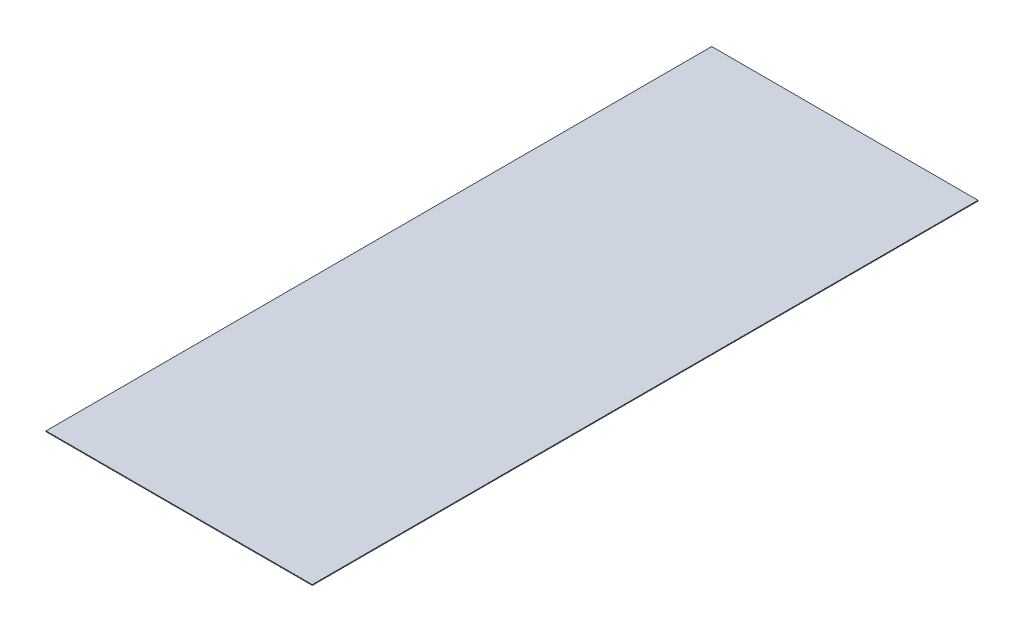
ISO-10303-21;
HEADER;
FILE_DESCRIPTION(('STEP AP214'),'2;1');
FILE_NAME('part.step','',(''),(''),'','','');
FILE_SCHEMA(('AUTOMOTIVE_DESIGN { 1 0 10303 214 1 1 1 1 }'));
ENDSEC;
DATA;
#1=APPLICATION_CONTEXT('core data for automotive mechanical design processes');
#2=APPLICATION_PROTOCOL_DEFINITION('international standard','automotive_design',2000,#1);
#3=PRODUCT_CONTEXT('',#1,'mechanical');
#4=PRODUCT('Part','Part','',(#3));
#5=PRODUCT_RELATED_PRODUCT_CATEGORY('part','',(#4));
#6=PRODUCT_DEFINITION_FORMATION('','',#4);
#7=PRODUCT_DEFINITION_CONTEXT('part definition',#1,'design');
#8=PRODUCT_DEFINITION('design','',#6,#7);
#9=PRODUCT_DEFINITION_SHAPE('','',#8);
#10=(LENGTH_UNIT() NAMED_UNIT(*) SI_UNIT(.MILLI.,.METRE.));
#11=(NAMED_UNIT(*) PLANE_ANGLE_UNIT() SI_UNIT($,.RADIAN.));
#12=(NAMED_UNIT(*) SI_UNIT($,.STERADIAN.) SOLID_ANGLE_UNIT());
#13=UNCERTAINTY_MEASURE_WITH_UNIT(LENGTH_MEASURE(1.E-05),#10,'distance_accuracy_value','');
#14=(GEOMETRIC_REPRESENTATION_CONTEXT(3) GLOBAL_UNCERTAINTY_ASSIGNED_CONTEXT((#13)) GLOBAL_UNIT_ASSIGNED_CONTEXT((#10,
#11,#12)) REPRESENTATION_CONTEXT('',''));
#15=CARTESIAN_POINT('',(0.,0.,0.));
#16=DIRECTION('',(0.,0.,1.));
#17=DIRECTION('',(1.,0.,0.));
#18=AXIS2_PLACEMENT_3D('',#15,#16,#17);
#19=CARTESIAN_POINT('',(609.6,3.4,1524.));
#20=DIRECTION('',(-1.,0.,0.));
#21=DIRECTION('',(0.,0.,1.));
#22=AXIS2_PLACEMENT_3D('',#19,#20,#21);
#23=PLANE('',#22);
#24=DIRECTION('',(0.,0.,-1.));
#25=VECTOR('',#24,1.);
#26=CARTESIAN_POINT('',(609.6,0.,1524.));
#27=LINE('',#26,#25);
#28=CARTESIAN_POINT('',(609.6,0.,1524.));
#29=VERTEX_POINT('',#28);
#30=CARTESIAN_POINT('',(609.6,0.,-1524.));
#31=VERTEX_POINT('',#30);
#32=EDGE_CURVE('E96',#29,#31,#27,.T.);
#33=ORIENTED_EDGE('',*,*,#32,.T.);
#34=DIRECTION('',(0.,-1.,0.));
#35=VECTOR('',#34,1.);
#36=CARTESIAN_POINT('',(609.6,3.4,-1524.));
#37=LINE('',#36,#35);
#38=CARTESIAN_POINT('',(609.6,3.4,-1524.));
#39=VERTEX_POINT('',#38);
#40=EDGE_CURVE('E11',#39,#31,#37,.T.);
#41=ORIENTED_EDGE('',*,*,#40,.F.);
#42=DIRECTION('',(0.,0.,-1.));
#43=VECTOR('',#42,1.);
#44=CARTESIAN_POINT('',(609.6,3.4,1524.));
#45=LINE('',#44,#43);
#46=CARTESIAN_POINT('',(609.6,3.4,1524.));
#47=VERTEX_POINT('',#46);
#48=EDGE_CURVE('E84',#47,#39,#45,.T.);
#49=ORIENTED_EDGE('',*,*,#48,.F.);
#50=DIRECTION('',(0.,-1.,0.));
#51=VECTOR('',#50,1.);
#52=CARTESIAN_POINT('',(609.6,3.4,1524.));
#53=LINE('',#52,#51);
#54=EDGE_CURVE('E92',#47,#29,#53,.T.);
#55=ORIENTED_EDGE('',*,*,#54,.T.);
#56=EDGE_LOOP('',(#33,#41,#49,#55));
#57=FACE_BOUND('',#56,.T.);
#58=ADVANCED_FACE('F33',(#57),#23,.F.);
#59=CARTESIAN_POINT('',(-609.6,3.4,-1524.));
#60=DIRECTION('',(0.,0.,1.));
#61=DIRECTION('',(1.,0.,0.));
#62=AXIS2_PLACEMENT_3D('',#59,#60,#61);
#63=PLANE('',#62);
#64=DIRECTION('',(-1.,0.,0.));
#65=VECTOR('',#64,1.);
#66=CARTESIAN_POINT('',(-609.6,0.,-1524.));
#67=LINE('',#66,#65);
#68=CARTESIAN_POINT('',(-609.6,0.,-1524.));
#69=VERTEX_POINT('',#68);
#70=EDGE_CURVE('E88',#31,#69,#67,.T.);
#71=ORIENTED_EDGE('',*,*,#70,.T.);
#72=DIRECTION('',(0.,-1.,0.));
#73=VECTOR('',#72,1.);
#74=CARTESIAN_POINT('',(-609.6,3.4,-1524.));
#75=LINE('',#74,#73);
#76=CARTESIAN_POINT('',(-609.6,3.4,-1524.));
#77=VERTEX_POINT('',#76);
#78=EDGE_CURVE('E41',#77,#69,#75,.T.);
#79=ORIENTED_EDGE('',*,*,#78,.F.);
#80=DIRECTION('',(-1.,0.,0.));
#81=VECTOR('',#80,1.);
#82=CARTESIAN_POINT('',(-609.6,3.4,-1524.));
#83=LINE('',#82,#81);
#84=EDGE_CURVE('E79',#39,#77,#83,.T.);
#85=ORIENTED_EDGE('',*,*,#84,.F.);
#86=ORIENTED_EDGE('',*,*,#40,.T.);
#87=EDGE_LOOP('',(#71,#79,#85,#86));
#88=FACE_BOUND('',#87,.T.);
#89=ADVANCED_FACE('F87',(#88),#63,.F.);
#90=CARTESIAN_POINT('',(-609.6,3.4,1524.));
#91=DIRECTION('',(1.,0.,0.));
#92=DIRECTION('',(0.,0.,-1.));
#93=AXIS2_PLACEMENT_3D('',#90,#91,#92);
#94=PLANE('',#93);
#95=DIRECTION('',(0.,0.,1.));
#96=VECTOR('',#95,1.);
#97=CARTESIAN_POINT('',(-609.6,0.,1524.));
#98=LINE('',#97,#96);
#99=CARTESIAN_POINT('',(-609.6,0.,1524.));
#100=VERTEX_POINT('',#99);
#101=EDGE_CURVE('E66',#69,#100,#98,.T.);
#102=ORIENTED_EDGE('',*,*,#101,.T.);
#103=DIRECTION('',(0.,-1.,0.));
#104=VECTOR('',#103,1.);
#105=CARTESIAN_POINT('',(-609.6,3.4,1524.));
#106=LINE('',#105,#104);
#107=CARTESIAN_POINT('',(-609.6,3.4,1524.));
#108=VERTEX_POINT('',#107);
#109=EDGE_CURVE('E89',#108,#100,#106,.T.);
#110=ORIENTED_EDGE('',*,*,#109,.F.);
#111=DIRECTION('',(0.,0.,1.));
#112=VECTOR('',#111,1.);
#113=CARTESIAN_POINT('',(-609.6,3.4,1524.));
#114=LINE('',#113,#112);
#115=EDGE_CURVE('E82',#77,#108,#114,.T.);
#116=ORIENTED_EDGE('',*,*,#115,.F.);
#117=ORIENTED_EDGE('',*,*,#78,.T.);
#118=EDGE_LOOP('',(#102,#110,#116,#117));
#119=FACE_BOUND('',#118,.T.);
#120=ADVANCED_FACE('F90',(#119),#94,.F.);
#121=CARTESIAN_POINT('',(-609.6,3.4,1524.));
#122=DIRECTION('',(0.,0.,-1.));
#123=DIRECTION('',(-1.,0.,0.));
#124=AXIS2_PLACEMENT_3D('',#121,#122,#123);
#125=PLANE('',#124);
#126=DIRECTION('',(1.,0.,0.));
#127=VECTOR('',#126,1.);
#128=CARTESIAN_POINT('',(-609.6,0.,1524.));
#129=LINE('',#128,#127);
#130=EDGE_CURVE('E72',#100,#29,#129,.T.);
#131=ORIENTED_EDGE('',*,*,#130,.T.);
#132=ORIENTED_EDGE('',*,*,#54,.F.);
#133=DIRECTION('',(1.,0.,0.));
#134=VECTOR('',#133,1.);
#135=CARTESIAN_POINT('',(-609.6,3.4,1524.));
#136=LINE('',#135,#134);
#137=EDGE_CURVE('E49',#108,#47,#136,.T.);
#138=ORIENTED_EDGE('',*,*,#137,.F.);
#139=ORIENTED_EDGE('',*,*,#109,.T.);
#140=EDGE_LOOP('',(#131,#132,#138,#139));
#141=FACE_BOUND('',#140,.T.);
#142=ADVANCED_FACE('F103',(#141),#125,.F.);
#143=CARTESIAN_POINT('',(0.,3.4,0.));
#144=DIRECTION('',(0.,-1.,0.));
#145=DIRECTION('',(0.,0.,-1.));
#146=AXIS2_PLACEMENT_3D('',#143,#144,#145);
#147=PLANE('',#146);
#148=ORIENTED_EDGE('',*,*,#48,.T.);
#149=ORIENTED_EDGE('',*,*,#84,.T.);
#150=ORIENTED_EDGE('',*,*,#115,.T.);
#151=ORIENTED_EDGE('',*,*,#137,.T.);
#152=EDGE_LOOP('',(#148,#149,#150,#151));
#153=FACE_BOUND('',#152,.T.);
#154=ADVANCED_FACE('F80',(#153),#147,.F.);
#155=CARTESIAN_POINT('',(0.,0.,0.));
#156=DIRECTION('',(0.,-1.,0.));
#157=DIRECTION('',(0.,0.,-1.));
#158=AXIS2_PLACEMENT_3D('',#155,#156,#157);
#159=PLANE('',#158);
#160=ORIENTED_EDGE('',*,*,#32,.F.);
#161=ORIENTED_EDGE('',*,*,#130,.F.);
#162=ORIENTED_EDGE('',*,*,#101,.F.);
#163=ORIENTED_EDGE('',*,*,#70,.F.);
#164=EDGE_LOOP('',(#160,#161,#162,#163));
#165=FACE_BOUND('',#164,.T.);
#166=ADVANCED_FACE('F106',(#165),#159,.T.);
#167=CLOSED_SHELL('',(#58,#89,#120,#142,#154,#166));
#168=MANIFOLD_SOLID_BREP('B2',#167);
#169=ADVANCED_BREP_SHAPE_REPRESENTATION('',(#18,#168),#14);
#170=SHAPE_DEFINITION_REPRESENTATION(#9,#169);
ENDSEC;
END-ISO-10303-21;
